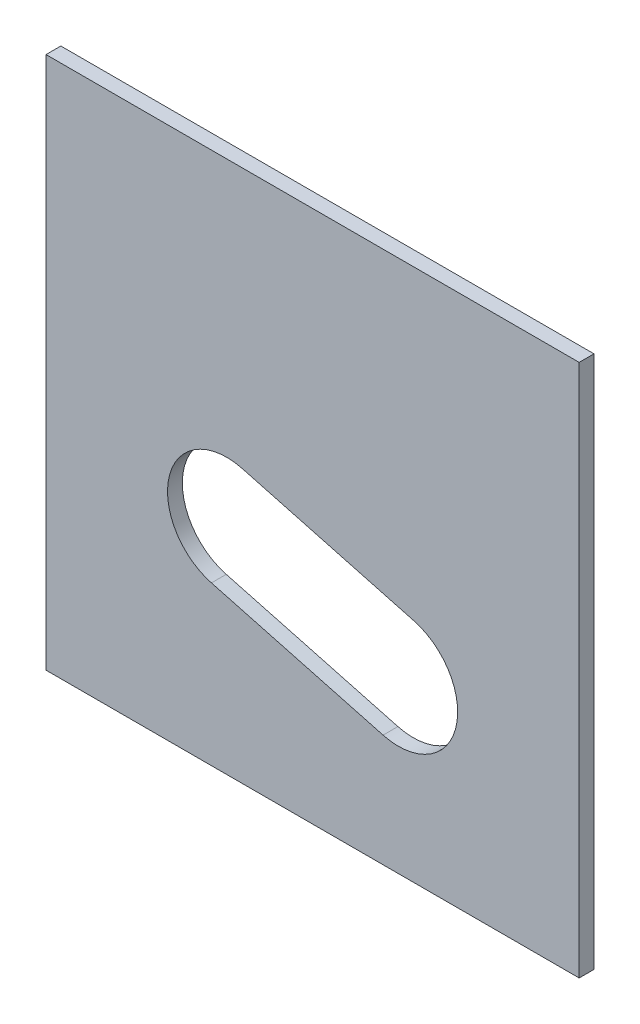
ISO-10303-21;
HEADER;
FILE_DESCRIPTION(('STEP AP214'),'2;1');
FILE_NAME('part.step','',(''),(''),'','','');
FILE_SCHEMA(('AUTOMOTIVE_DESIGN { 1 0 10303 214 1 1 1 1 }'));
ENDSEC;
DATA;
#1=APPLICATION_CONTEXT('core data for automotive mechanical design processes');
#2=APPLICATION_PROTOCOL_DEFINITION('international standard','automotive_design',2000,#1);
#3=PRODUCT_CONTEXT('',#1,'mechanical');
#4=PRODUCT('Part','Part','',(#3));
#5=PRODUCT_RELATED_PRODUCT_CATEGORY('part','',(#4));
#6=PRODUCT_DEFINITION_FORMATION('','',#4);
#7=PRODUCT_DEFINITION_CONTEXT('part definition',#1,'design');
#8=PRODUCT_DEFINITION('design','',#6,#7);
#9=PRODUCT_DEFINITION_SHAPE('','',#8);
#10=(LENGTH_UNIT() NAMED_UNIT(*) SI_UNIT(.MILLI.,.METRE.));
#11=(NAMED_UNIT(*) PLANE_ANGLE_UNIT() SI_UNIT($,.RADIAN.));
#12=(NAMED_UNIT(*) SI_UNIT($,.STERADIAN.) SOLID_ANGLE_UNIT());
#13=UNCERTAINTY_MEASURE_WITH_UNIT(LENGTH_MEASURE(1.E-05),#10,'distance_accuracy_value','');
#14=(GEOMETRIC_REPRESENTATION_CONTEXT(3) GLOBAL_UNCERTAINTY_ASSIGNED_CONTEXT((#13)) GLOBAL_UNIT_ASSIGNED_CONTEXT((#10,
#11,#12)) REPRESENTATION_CONTEXT('',''));
#15=CARTESIAN_POINT('',(0.,0.,0.));
#16=DIRECTION('',(0.,0.,1.));
#17=DIRECTION('',(1.,0.,0.));
#18=AXIS2_PLACEMENT_3D('',#15,#16,#17);
#19=CARTESIAN_POINT('',(90.,-90.,5.));
#20=DIRECTION('',(-1.,0.,0.));
#21=DIRECTION('',(0.,0.,1.));
#22=AXIS2_PLACEMENT_3D('',#19,#20,#21);
#23=PLANE('',#22);
#24=DIRECTION('',(0.,1.,0.));
#25=VECTOR('',#24,1.);
#26=CARTESIAN_POINT('',(90.,-90.,0.));
#27=LINE('',#26,#25);
#28=CARTESIAN_POINT('',(90.,-90.,0.));
#29=VERTEX_POINT('',#28);
#30=CARTESIAN_POINT('',(90.,90.,0.));
#31=VERTEX_POINT('',#30);
#32=EDGE_CURVE('E130',#29,#31,#27,.T.);
#33=ORIENTED_EDGE('',*,*,#32,.T.);
#34=DIRECTION('',(0.,0.,-1.));
#35=VECTOR('',#34,1.);
#36=CARTESIAN_POINT('',(90.,90.,5.));
#37=LINE('',#36,#35);
#38=CARTESIAN_POINT('',(90.,90.,5.));
#39=VERTEX_POINT('',#38);
#40=EDGE_CURVE('E11',#39,#31,#37,.T.);
#41=ORIENTED_EDGE('',*,*,#40,.F.);
#42=DIRECTION('',(0.,1.,0.));
#43=VECTOR('',#42,1.);
#44=CARTESIAN_POINT('',(90.,-90.,5.));
#45=LINE('',#44,#43);
#46=CARTESIAN_POINT('',(90.,-90.,5.));
#47=VERTEX_POINT('',#46);
#48=EDGE_CURVE('E134',#47,#39,#45,.T.);
#49=ORIENTED_EDGE('',*,*,#48,.F.);
#50=DIRECTION('',(0.,0.,-1.));
#51=VECTOR('',#50,1.);
#52=CARTESIAN_POINT('',(90.,-90.,5.));
#53=LINE('',#52,#51);
#54=EDGE_CURVE('E144',#47,#29,#53,.T.);
#55=ORIENTED_EDGE('',*,*,#54,.T.);
#56=EDGE_LOOP('',(#33,#41,#49,#55));
#57=FACE_BOUND('',#56,.T.);
#58=ADVANCED_FACE('F33',(#57),#23,.F.);
#59=CARTESIAN_POINT('',(-90.,90.,5.));
#60=DIRECTION('',(0.,-1.,0.));
#61=DIRECTION('',(0.,0.,-1.));
#62=AXIS2_PLACEMENT_3D('',#59,#60,#61);
#63=PLANE('',#62);
#64=DIRECTION('',(-1.,0.,0.));
#65=VECTOR('',#64,1.);
#66=CARTESIAN_POINT('',(-90.,90.,0.));
#67=LINE('',#66,#65);
#68=CARTESIAN_POINT('',(-90.,90.,0.));
#69=VERTEX_POINT('',#68);
#70=EDGE_CURVE('E147',#31,#69,#67,.T.);
#71=ORIENTED_EDGE('',*,*,#70,.T.);
#72=DIRECTION('',(0.,0.,-1.));
#73=VECTOR('',#72,1.);
#74=CARTESIAN_POINT('',(-90.,90.,5.));
#75=LINE('',#74,#73);
#76=CARTESIAN_POINT('',(-90.,90.,5.));
#77=VERTEX_POINT('',#76);
#78=EDGE_CURVE('E40',#77,#69,#75,.T.);
#79=ORIENTED_EDGE('',*,*,#78,.F.);
#80=DIRECTION('',(-1.,0.,0.));
#81=VECTOR('',#80,1.);
#82=CARTESIAN_POINT('',(-90.,90.,5.));
#83=LINE('',#82,#81);
#84=EDGE_CURVE('E137',#39,#77,#83,.T.);
#85=ORIENTED_EDGE('',*,*,#84,.F.);
#86=ORIENTED_EDGE('',*,*,#40,.T.);
#87=EDGE_LOOP('',(#71,#79,#85,#86));
#88=FACE_BOUND('',#87,.T.);
#89=ADVANCED_FACE('F175',(#88),#63,.F.);
#90=CARTESIAN_POINT('',(-90.,-90.,5.));
#91=DIRECTION('',(1.,0.,0.));
#92=DIRECTION('',(0.,0.,-1.));
#93=AXIS2_PLACEMENT_3D('',#90,#91,#92);
#94=PLANE('',#93);
#95=DIRECTION('',(0.,-1.,0.));
#96=VECTOR('',#95,1.);
#97=CARTESIAN_POINT('',(-90.,-90.,0.));
#98=LINE('',#97,#96);
#99=CARTESIAN_POINT('',(-90.,-90.,0.));
#100=VERTEX_POINT('',#99);
#101=EDGE_CURVE('E149',#69,#100,#98,.T.);
#102=ORIENTED_EDGE('',*,*,#101,.T.);
#103=DIRECTION('',(0.,0.,-1.));
#104=VECTOR('',#103,1.);
#105=CARTESIAN_POINT('',(-90.,-90.,5.));
#106=LINE('',#105,#104);
#107=CARTESIAN_POINT('',(-90.,-90.,5.));
#108=VERTEX_POINT('',#107);
#109=EDGE_CURVE('E154',#108,#100,#106,.T.);
#110=ORIENTED_EDGE('',*,*,#109,.F.);
#111=DIRECTION('',(0.,-1.,0.));
#112=VECTOR('',#111,1.);
#113=CARTESIAN_POINT('',(-90.,-90.,5.));
#114=LINE('',#113,#112);
#115=EDGE_CURVE('E140',#77,#108,#114,.T.);
#116=ORIENTED_EDGE('',*,*,#115,.F.);
#117=ORIENTED_EDGE('',*,*,#78,.T.);
#118=EDGE_LOOP('',(#102,#110,#116,#117));
#119=FACE_BOUND('',#118,.T.);
#120=ADVANCED_FACE('F161',(#119),#94,.F.);
#121=CARTESIAN_POINT('',(-90.,-90.,5.));
#122=DIRECTION('',(0.,1.,0.));
#123=DIRECTION('',(0.,0.,1.));
#124=AXIS2_PLACEMENT_3D('',#121,#122,#123);
#125=PLANE('',#124);
#126=DIRECTION('',(1.,0.,0.));
#127=VECTOR('',#126,1.);
#128=CARTESIAN_POINT('',(-90.,-90.,0.));
#129=LINE('',#128,#127);
#130=EDGE_CURVE('E138',#100,#29,#129,.T.);
#131=ORIENTED_EDGE('',*,*,#130,.T.);
#132=ORIENTED_EDGE('',*,*,#54,.F.);
#133=DIRECTION('',(1.,0.,0.));
#134=VECTOR('',#133,1.);
#135=CARTESIAN_POINT('',(-90.,-90.,5.));
#136=LINE('',#135,#134);
#137=EDGE_CURVE('E142',#108,#47,#136,.T.);
#138=ORIENTED_EDGE('',*,*,#137,.F.);
#139=ORIENTED_EDGE('',*,*,#109,.T.);
#140=EDGE_LOOP('',(#131,#132,#138,#139));
#141=FACE_BOUND('',#140,.T.);
#142=ADVANCED_FACE('F170',(#141),#125,.F.);
#143=CARTESIAN_POINT('',(0.,0.,5.));
#144=DIRECTION('',(0.,0.,-1.));
#145=DIRECTION('',(-1.,0.,0.));
#146=AXIS2_PLACEMENT_3D('',#143,#144,#145);
#147=PLANE('',#146);
#148=DIRECTION('',(0.96592582628907,-0.258819045102515,0.));
#149=VECTOR('',#148,1.);
#150=CARTESIAN_POINT('',(34.1541556907224,-13.446054827294,5.));
#151=LINE('',#150,#149);
#152=CARTESIAN_POINT('',(-23.8013938866218,2.08308787885685,5.));
#153=VERTEX_POINT('',#152);
#154=CARTESIAN_POINT('',(34.1541556907224,-13.446054827294,5.));
#155=VERTEX_POINT('',#154);
#156=EDGE_CURVE('E105',#153,#155,#151,.T.);
#157=ORIENTED_EDGE('',*,*,#156,.T.);
#158=CARTESIAN_POINT('',(28.9777747886721,-32.7645713530754,5.));
#159=DIRECTION('',(0.,0.,-1.));
#160=DIRECTION('',(-1.,0.,0.));
#161=AXIS2_PLACEMENT_3D('',#158,#159,#160);
#162=CIRCLE('',#161,20.);
#163=CARTESIAN_POINT('',(23.8013938866218,-52.0830878788568,5.));
#164=VERTEX_POINT('',#163);
#165=EDGE_CURVE('E99',#155,#164,#162,.T.);
#166=ORIENTED_EDGE('',*,*,#165,.T.);
#167=DIRECTION('',(-0.96592582628907,0.258819045102515,0.));
#168=VECTOR('',#167,1.);
#169=CARTESIAN_POINT('',(23.8013938866218,-52.0830878788568,5.));
#170=LINE('',#169,#168);
#171=CARTESIAN_POINT('',(-34.1541556907224,-36.5539451727059,5.));
#172=VERTEX_POINT('',#171);
#173=EDGE_CURVE('E108',#164,#172,#170,.T.);
#174=ORIENTED_EDGE('',*,*,#173,.T.);
#175=CARTESIAN_POINT('',(-28.9777747886721,-17.2354286469246,5.));
#176=DIRECTION('',(0.,0.,-1.));
#177=DIRECTION('',(-1.,0.,0.));
#178=AXIS2_PLACEMENT_3D('',#175,#176,#177);
#179=CIRCLE('',#178,20.);
#180=EDGE_CURVE('E47',#172,#153,#179,.T.);
#181=ORIENTED_EDGE('',*,*,#180,.T.);
#182=EDGE_LOOP('',(#157,#166,#174,#181));
#183=FACE_BOUND('',#182,.T.);
#184=ORIENTED_EDGE('',*,*,#48,.T.);
#185=ORIENTED_EDGE('',*,*,#84,.T.);
#186=ORIENTED_EDGE('',*,*,#115,.T.);
#187=ORIENTED_EDGE('',*,*,#137,.T.);
#188=EDGE_LOOP('',(#184,#185,#186,#187));
#189=FACE_BOUND('',#188,.T.);
#190=ADVANCED_FACE('F112',(#183,#189),#147,.F.);
#191=CARTESIAN_POINT('',(0.,0.,0.));
#192=DIRECTION('',(0.,0.,-1.));
#193=DIRECTION('',(-1.,0.,0.));
#194=AXIS2_PLACEMENT_3D('',#191,#192,#193);
#195=PLANE('',#194);
#196=CARTESIAN_POINT('',(28.9777747886721,-32.7645713530754,0.));
#197=DIRECTION('',(0.,0.,-1.));
#198=DIRECTION('',(-1.,0.,0.));
#199=AXIS2_PLACEMENT_3D('',#196,#197,#198);
#200=CIRCLE('',#199,20.);
#201=CARTESIAN_POINT('',(34.1541556907224,-13.446054827294,0.));
#202=VERTEX_POINT('',#201);
#203=CARTESIAN_POINT('',(23.8013938866218,-52.0830878788568,0.));
#204=VERTEX_POINT('',#203);
#205=EDGE_CURVE('E55',#202,#204,#200,.T.);
#206=ORIENTED_EDGE('',*,*,#205,.F.);
#207=DIRECTION('',(0.96592582628907,-0.258819045102515,0.));
#208=VECTOR('',#207,1.);
#209=CARTESIAN_POINT('',(34.1541556907224,-13.446054827294,0.));
#210=LINE('',#209,#208);
#211=CARTESIAN_POINT('',(-23.8013938866218,2.08308787885685,0.));
#212=VERTEX_POINT('',#211);
#213=EDGE_CURVE('E115',#212,#202,#210,.T.);
#214=ORIENTED_EDGE('',*,*,#213,.F.);
#215=CARTESIAN_POINT('',(-28.9777747886721,-17.2354286469246,0.));
#216=DIRECTION('',(0.,0.,-1.));
#217=DIRECTION('',(-1.,0.,0.));
#218=AXIS2_PLACEMENT_3D('',#215,#216,#217);
#219=CIRCLE('',#218,20.);
#220=CARTESIAN_POINT('',(-34.1541556907224,-36.553945172706,0.));
#221=VERTEX_POINT('',#220);
#222=EDGE_CURVE('E118',#221,#212,#219,.T.);
#223=ORIENTED_EDGE('',*,*,#222,.F.);
#224=DIRECTION('',(-0.96592582628907,0.258819045102515,0.));
#225=VECTOR('',#224,1.);
#226=CARTESIAN_POINT('',(23.8013938866218,-52.0830878788568,0.));
#227=LINE('',#226,#225);
#228=EDGE_CURVE('E124',#204,#221,#227,.T.);
#229=ORIENTED_EDGE('',*,*,#228,.F.);
#230=EDGE_LOOP('',(#206,#214,#223,#229));
#231=FACE_BOUND('',#230,.T.);
#232=ORIENTED_EDGE('',*,*,#32,.F.);
#233=ORIENTED_EDGE('',*,*,#130,.F.);
#234=ORIENTED_EDGE('',*,*,#101,.F.);
#235=ORIENTED_EDGE('',*,*,#70,.F.);
#236=EDGE_LOOP('',(#232,#233,#234,#235));
#237=FACE_BOUND('',#236,.T.);
#238=ADVANCED_FACE('F167',(#231,#237),#195,.T.);
#239=CARTESIAN_POINT('',(28.9777747886721,-32.7645713530754,5.));
#240=DIRECTION('',(0.,0.,-1.));
#241=DIRECTION('',(-1.,0.,0.));
#242=AXIS2_PLACEMENT_3D('',#239,#240,#241);
#243=CYLINDRICAL_SURFACE('',#242,20.);
#244=ORIENTED_EDGE('',*,*,#205,.T.);
#245=DIRECTION('',(0.,0.,-1.));
#246=VECTOR('',#245,1.);
#247=CARTESIAN_POINT('',(23.8013938866218,-52.0830878788568,5.));
#248=LINE('',#247,#246);
#249=EDGE_CURVE('E95',#164,#204,#248,.T.);
#250=ORIENTED_EDGE('',*,*,#249,.F.);
#251=ORIENTED_EDGE('',*,*,#165,.F.);
#252=DIRECTION('',(0.,0.,-1.));
#253=VECTOR('',#252,1.);
#254=CARTESIAN_POINT('',(34.1541556907224,-13.446054827294,5.));
#255=LINE('',#254,#253);
#256=EDGE_CURVE('E128',#155,#202,#255,.T.);
#257=ORIENTED_EDGE('',*,*,#256,.T.);
#258=EDGE_LOOP('',(#244,#250,#251,#257));
#259=FACE_BOUND('',#258,.T.);
#260=ADVANCED_FACE('F97',(#259),#243,.F.);
#261=CARTESIAN_POINT('',(34.1541556907224,-13.446054827294,5.));
#262=DIRECTION('',(0.258819045102515,0.96592582628907,0.));
#263=DIRECTION('',(-0.96592582628907,0.258819045102515,0.));
#264=AXIS2_PLACEMENT_3D('',#261,#262,#263);
#265=PLANE('',#264);
#266=ORIENTED_EDGE('',*,*,#213,.T.);
#267=ORIENTED_EDGE('',*,*,#256,.F.);
#268=ORIENTED_EDGE('',*,*,#156,.F.);
#269=DIRECTION('',(0.,0.,-1.));
#270=VECTOR('',#269,1.);
#271=CARTESIAN_POINT('',(-23.8013938866218,2.08308787885685,5.));
#272=LINE('',#271,#270);
#273=EDGE_CURVE('E131',#153,#212,#272,.T.);
#274=ORIENTED_EDGE('',*,*,#273,.T.);
#275=EDGE_LOOP('',(#266,#267,#268,#274));
#276=FACE_BOUND('',#275,.T.);
#277=ADVANCED_FACE('F192',(#276),#265,.F.);
#278=CARTESIAN_POINT('',(-28.9777747886721,-17.2354286469246,5.));
#279=DIRECTION('',(0.,0.,-1.));
#280=DIRECTION('',(-1.,0.,0.));
#281=AXIS2_PLACEMENT_3D('',#278,#279,#280);
#282=CYLINDRICAL_SURFACE('',#281,20.);
#283=ORIENTED_EDGE('',*,*,#222,.T.);
#284=ORIENTED_EDGE('',*,*,#273,.F.);
#285=ORIENTED_EDGE('',*,*,#180,.F.);
#286=DIRECTION('',(0.,0.,-1.));
#287=VECTOR('',#286,1.);
#288=CARTESIAN_POINT('',(-34.1541556907224,-36.553945172706,5.));
#289=LINE('',#288,#287);
#290=EDGE_CURVE('E104',#172,#221,#289,.T.);
#291=ORIENTED_EDGE('',*,*,#290,.T.);
#292=EDGE_LOOP('',(#283,#284,#285,#291));
#293=FACE_BOUND('',#292,.T.);
#294=ADVANCED_FACE('F195',(#293),#282,.F.);
#295=CARTESIAN_POINT('',(23.8013938866218,-52.0830878788568,5.));
#296=DIRECTION('',(-0.258819045102515,-0.96592582628907,0.));
#297=DIRECTION('',(0.96592582628907,-0.258819045102515,0.));
#298=AXIS2_PLACEMENT_3D('',#295,#296,#297);
#299=PLANE('',#298);
#300=ORIENTED_EDGE('',*,*,#228,.T.);
#301=ORIENTED_EDGE('',*,*,#290,.F.);
#302=ORIENTED_EDGE('',*,*,#173,.F.);
#303=ORIENTED_EDGE('',*,*,#249,.T.);
#304=EDGE_LOOP('',(#300,#301,#302,#303));
#305=FACE_BOUND('',#304,.T.);
#306=ADVANCED_FACE('F109',(#305),#299,.F.);
#307=CLOSED_SHELL('',(#58,#89,#120,#142,#190,#238,#260,#277,#294,#306));
#308=MANIFOLD_SOLID_BREP('B2',#307);
#309=ADVANCED_BREP_SHAPE_REPRESENTATION('',(#18,#308),#14);
#310=SHAPE_DEFINITION_REPRESENTATION(#9,#309);
ENDSEC;
END-ISO-10303-21;
